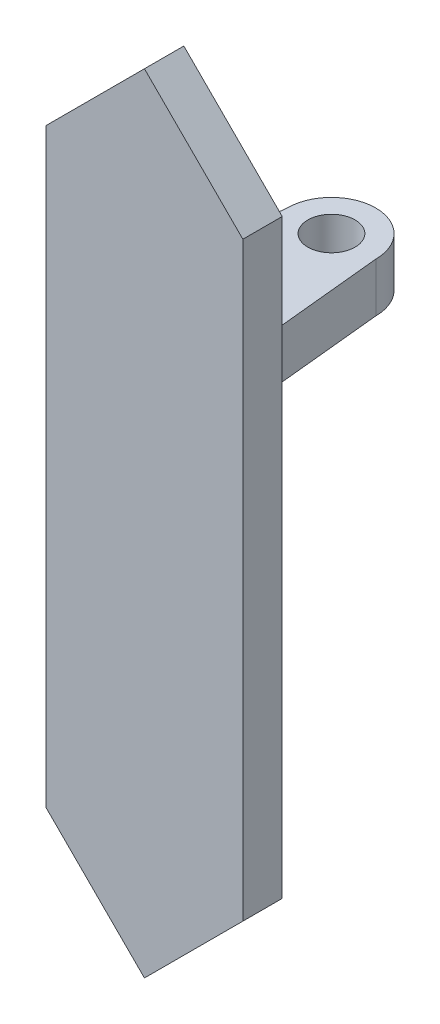
ISO-10303-21;
HEADER;
FILE_DESCRIPTION(('STEP AP214'),'2;1');
FILE_NAME('part.step','',(''),(''),'','','');
FILE_SCHEMA(('AUTOMOTIVE_DESIGN { 1 0 10303 214 1 1 1 1 }'));
ENDSEC;
DATA;
#1=APPLICATION_CONTEXT('core data for automotive mechanical design processes');
#2=APPLICATION_PROTOCOL_DEFINITION('international standard','automotive_design',2000,#1);
#3=PRODUCT_CONTEXT('',#1,'mechanical');
#4=PRODUCT('Part','Part','',(#3));
#5=PRODUCT_RELATED_PRODUCT_CATEGORY('part','',(#4));
#6=PRODUCT_DEFINITION_FORMATION('','',#4);
#7=PRODUCT_DEFINITION_CONTEXT('part definition',#1,'design');
#8=PRODUCT_DEFINITION('design','',#6,#7);
#9=PRODUCT_DEFINITION_SHAPE('','',#8);
#10=(LENGTH_UNIT() NAMED_UNIT(*) SI_UNIT(.MILLI.,.METRE.));
#11=(NAMED_UNIT(*) PLANE_ANGLE_UNIT() SI_UNIT($,.RADIAN.));
#12=(NAMED_UNIT(*) SI_UNIT($,.STERADIAN.) SOLID_ANGLE_UNIT());
#13=UNCERTAINTY_MEASURE_WITH_UNIT(LENGTH_MEASURE(1.E-05),#10,'distance_accuracy_value','');
#14=(GEOMETRIC_REPRESENTATION_CONTEXT(3) GLOBAL_UNCERTAINTY_ASSIGNED_CONTEXT((#13)) GLOBAL_UNIT_ASSIGNED_CONTEXT((#10,
#11,#12)) REPRESENTATION_CONTEXT('',''));
#15=CARTESIAN_POINT('',(0.,0.,0.));
#16=DIRECTION('',(0.,0.,1.));
#17=DIRECTION('',(1.,0.,0.));
#18=AXIS2_PLACEMENT_3D('',#15,#16,#17);
#19=CARTESIAN_POINT('',(0.,56.,-20.));
#20=DIRECTION('',(0.,1.,0.));
#21=DIRECTION('',(0.,0.,1.));
#22=AXIS2_PLACEMENT_3D('',#19,#20,#21);
#23=PLANE('',#22);
#24=CARTESIAN_POINT('',(10.1472812853162,56.,-15.));
#25=DIRECTION('',(0.,1.,0.));
#26=DIRECTION('',(0.,0.,1.));
#27=AXIS2_PLACEMENT_3D('',#24,#25,#26);
#28=CIRCLE('',#27,2.4);
#29=CARTESIAN_POINT('',(10.1472812853162,56.,-12.6));
#30=VERTEX_POINT('',#29);
#31=EDGE_CURVE('E268',#30,#30,#28,.T.);
#32=ORIENTED_EDGE('',*,*,#31,.F.);
#33=EDGE_LOOP('',(#32));
#34=FACE_BOUND('',#33,.T.);
#35=DIRECTION('',(-1.,0.,0.));
#36=VECTOR('',#35,1.);
#37=CARTESIAN_POINT('',(0.,56.,0.));
#38=LINE('',#37,#36);
#39=CARTESIAN_POINT('',(16.1472812853161,56.,0.));
#40=VERTEX_POINT('',#39);
#41=CARTESIAN_POINT('',(4.14728128531616,56.,0.));
#42=VERTEX_POINT('',#41);
#43=EDGE_CURVE('E248',#40,#42,#38,.T.);
#44=ORIENTED_EDGE('',*,*,#43,.F.);
#45=DIRECTION('',(-0.0995037190209997,0.,-0.995037190209989));
#46=VECTOR('',#45,1.);
#47=CARTESIAN_POINT('',(14.0072091933823,56.,-21.4007209193382));
#48=LINE('',#47,#46);
#49=CARTESIAN_POINT('',(14.6472812853162,56.,-15.));
#50=VERTEX_POINT('',#49);
#51=EDGE_CURVE('E260',#40,#50,#48,.T.);
#52=ORIENTED_EDGE('',*,*,#51,.T.);
#53=CARTESIAN_POINT('',(10.1472812853162,56.,-15.));
#54=DIRECTION('',(0.,1.,0.));
#55=DIRECTION('',(0.,0.,1.));
#56=AXIS2_PLACEMENT_3D('',#53,#54,#55);
#57=CIRCLE('',#56,4.5);
#58=CARTESIAN_POINT('',(5.64728128531617,56.,-15.));
#59=VERTEX_POINT('',#58);
#60=EDGE_CURVE('E256',#50,#59,#57,.T.);
#61=ORIENTED_EDGE('',*,*,#60,.T.);
#62=DIRECTION('',(0.0995037190209997,0.,-0.995037190209989));
#63=VECTOR('',#62,1.);
#64=CARTESIAN_POINT('',(6.08641711417443,56.,-19.3913582885826));
#65=LINE('',#64,#63);
#66=EDGE_CURVE('E264',#42,#59,#65,.T.);
#67=ORIENTED_EDGE('',*,*,#66,.F.);
#68=EDGE_LOOP('',(#44,#52,#61,#67));
#69=FACE_BOUND('',#68,.T.);
#70=ADVANCED_FACE('F98',(#34,#69),#23,.T.);
#71=CARTESIAN_POINT('',(0.,51.,-20.));
#72=DIRECTION('',(0.,1.,0.));
#73=DIRECTION('',(0.,0.,1.));
#74=AXIS2_PLACEMENT_3D('',#71,#72,#73);
#75=PLANE('',#74);
#76=CARTESIAN_POINT('',(10.1472812853162,51.,-15.));
#77=DIRECTION('',(0.,-1.,0.));
#78=DIRECTION('',(0.,0.,-1.));
#79=AXIS2_PLACEMENT_3D('',#76,#77,#78);
#80=CIRCLE('',#79,2.4);
#81=CARTESIAN_POINT('',(10.1472812853162,51.,-17.4));
#82=VERTEX_POINT('',#81);
#83=EDGE_CURVE('E272',#82,#82,#80,.T.);
#84=ORIENTED_EDGE('',*,*,#83,.F.);
#85=EDGE_LOOP('',(#84));
#86=FACE_BOUND('',#85,.T.);
#87=DIRECTION('',(0.0995037190209997,0.,0.995037190209989));
#88=VECTOR('',#87,1.);
#89=CARTESIAN_POINT('',(15.9874072131843,51.,-1.59874072131845));
#90=LINE('',#89,#88);
#91=CARTESIAN_POINT('',(14.6472812853162,51.,-15.));
#92=VERTEX_POINT('',#91);
#93=CARTESIAN_POINT('',(16.1472812853161,51.,0.));
#94=VERTEX_POINT('',#93);
#95=EDGE_CURVE('E280',#92,#94,#90,.T.);
#96=ORIENTED_EDGE('',*,*,#95,.T.);
#97=DIRECTION('',(-1.,0.,0.));
#98=VECTOR('',#97,1.);
#99=CARTESIAN_POINT('',(0.,51.,0.));
#100=LINE('',#99,#98);
#101=CARTESIAN_POINT('',(4.14728128531616,51.,0.));
#102=VERTEX_POINT('',#101);
#103=EDGE_CURVE('E202',#94,#102,#100,.T.);
#104=ORIENTED_EDGE('',*,*,#103,.T.);
#105=DIRECTION('',(-0.0995037190209997,0.,0.995037190209989));
#106=VECTOR('',#105,1.);
#107=CARTESIAN_POINT('',(4.10621909437243,51.,0.410621909437246));
#108=LINE('',#107,#106);
#109=CARTESIAN_POINT('',(5.64728128531617,51.,-15.));
#110=VERTEX_POINT('',#109);
#111=EDGE_CURVE('E286',#110,#102,#108,.T.);
#112=ORIENTED_EDGE('',*,*,#111,.F.);
#113=CARTESIAN_POINT('',(10.1472812853162,51.,-15.));
#114=DIRECTION('',(0.,-1.,0.));
#115=DIRECTION('',(0.,0.,-1.));
#116=AXIS2_PLACEMENT_3D('',#113,#114,#115);
#117=CIRCLE('',#116,4.5);
#118=EDGE_CURVE('E114',#110,#92,#117,.T.);
#119=ORIENTED_EDGE('',*,*,#118,.T.);
#120=EDGE_LOOP('',(#96,#104,#112,#119));
#121=FACE_BOUND('',#120,.T.);
#122=ADVANCED_FACE('F294',(#86,#121),#75,.F.);
#123=CARTESIAN_POINT('',(45.0736406426581,45.0736406426581,4.));
#124=DIRECTION('',(0.707106781186548,0.707106781186547,0.));
#125=DIRECTION('',(-0.707106781186547,0.707106781186548,0.));
#126=AXIS2_PLACEMENT_3D('',#123,#124,#125);
#127=PLANE('',#126);
#128=DIRECTION('',(0.707106781186547,-0.707106781186548,0.));
#129=VECTOR('',#128,1.);
#130=CARTESIAN_POINT('',(45.0736406426581,45.0736406426581,0.));
#131=LINE('',#130,#129);
#132=CARTESIAN_POINT('',(10.1472812853162,80.,0.));
#133=VERTEX_POINT('',#132);
#134=CARTESIAN_POINT('',(20.1472812853162,70.,0.));
#135=VERTEX_POINT('',#134);
#136=EDGE_CURVE('E210',#133,#135,#131,.T.);
#137=ORIENTED_EDGE('',*,*,#136,.F.);
#138=DIRECTION('',(0.,0.,-1.));
#139=VECTOR('',#138,1.);
#140=CARTESIAN_POINT('',(10.1472812853162,80.,4.));
#141=LINE('',#140,#139);
#142=CARTESIAN_POINT('',(10.1472812853162,80.,4.));
#143=VERTEX_POINT('',#142);
#144=EDGE_CURVE('E188',#143,#133,#141,.T.);
#145=ORIENTED_EDGE('',*,*,#144,.F.);
#146=DIRECTION('',(0.707106781186547,-0.707106781186548,0.));
#147=VECTOR('',#146,1.);
#148=CARTESIAN_POINT('',(45.0736406426581,45.0736406426581,4.));
#149=LINE('',#148,#147);
#150=CARTESIAN_POINT('',(20.1472812853162,70.,4.));
#151=VERTEX_POINT('',#150);
#152=EDGE_CURVE('E170',#143,#151,#149,.T.);
#153=ORIENTED_EDGE('',*,*,#152,.T.);
#154=DIRECTION('',(0.,0.,-1.));
#155=VECTOR('',#154,1.);
#156=CARTESIAN_POINT('',(20.1472812853162,70.,4.));
#157=LINE('',#156,#155);
#158=EDGE_CURVE('E179',#151,#135,#157,.T.);
#159=ORIENTED_EDGE('',*,*,#158,.T.);
#160=EDGE_LOOP('',(#137,#145,#153,#159));
#161=FACE_BOUND('',#160,.T.);
#162=ADVANCED_FACE('F190',(#161),#127,.T.);
#163=CARTESIAN_POINT('',(0.,0.,0.));
#164=DIRECTION('',(0.,0.,1.));
#165=DIRECTION('',(1.,0.,0.));
#166=AXIS2_PLACEMENT_3D('',#163,#164,#165);
#167=PLANE('',#166);
#168=ORIENTED_EDGE('',*,*,#43,.T.);
#169=DIRECTION('',(0.,-1.,0.));
#170=VECTOR('',#169,1.);
#171=CARTESIAN_POINT('',(4.14728128531616,0.,0.));
#172=LINE('',#171,#170);
#173=EDGE_CURVE('E252',#42,#102,#172,.T.);
#174=ORIENTED_EDGE('',*,*,#173,.T.);
#175=ORIENTED_EDGE('',*,*,#103,.F.);
#176=DIRECTION('',(0.,-1.,0.));
#177=VECTOR('',#176,1.);
#178=CARTESIAN_POINT('',(16.1472812853161,0.,0.));
#179=LINE('',#178,#177);
#180=EDGE_CURVE('E244',#40,#94,#179,.T.);
#181=ORIENTED_EDGE('',*,*,#180,.F.);
#182=EDGE_LOOP('',(#168,#174,#175,#181));
#183=FACE_BOUND('',#182,.T.);
#184=DIRECTION('',(0.,1.,0.));
#185=VECTOR('',#184,1.);
#186=CARTESIAN_POINT('',(0.147281285316174,0.,0.));
#187=LINE('',#186,#185);
#188=CARTESIAN_POINT('',(0.147281285316174,9.99999999999999,0.));
#189=VERTEX_POINT('',#188);
#190=CARTESIAN_POINT('',(0.147281285316174,70.,0.));
#191=VERTEX_POINT('',#190);
#192=EDGE_CURVE('E198',#189,#191,#187,.T.);
#193=ORIENTED_EDGE('',*,*,#192,.T.);
#194=DIRECTION('',(0.707106781186548,0.707106781186548,0.));
#195=VECTOR('',#194,1.);
#196=CARTESIAN_POINT('',(-34.9263593573419,34.9263593573419,0.));
#197=LINE('',#196,#195);
#198=EDGE_CURVE('E213',#191,#133,#197,.T.);
#199=ORIENTED_EDGE('',*,*,#198,.T.);
#200=ORIENTED_EDGE('',*,*,#136,.T.);
#201=DIRECTION('',(0.,1.,0.));
#202=VECTOR('',#201,1.);
#203=CARTESIAN_POINT('',(20.1472812853162,0.,0.));
#204=LINE('',#203,#202);
#205=CARTESIAN_POINT('',(20.1472812853162,10.,0.));
#206=VERTEX_POINT('',#205);
#207=EDGE_CURVE('E182',#206,#135,#204,.T.);
#208=ORIENTED_EDGE('',*,*,#207,.F.);
#209=DIRECTION('',(0.707106781186548,0.707106781186548,0.));
#210=VECTOR('',#209,1.);
#211=CARTESIAN_POINT('',(5.07364064265808,-5.07364064265808,0.));
#212=LINE('',#211,#210);
#213=CARTESIAN_POINT('',(10.1472812853162,0.,0.));
#214=VERTEX_POINT('',#213);
#215=EDGE_CURVE('E205',#214,#206,#212,.T.);
#216=ORIENTED_EDGE('',*,*,#215,.F.);
#217=DIRECTION('',(0.707106781186548,-0.707106781186548,0.));
#218=VECTOR('',#217,1.);
#219=CARTESIAN_POINT('',(5.07364064265808,5.07364064265808,0.));
#220=LINE('',#219,#218);
#221=EDGE_CURVE('E201',#189,#214,#220,.T.);
#222=ORIENTED_EDGE('',*,*,#221,.F.);
#223=EDGE_LOOP('',(#193,#199,#200,#208,#216,#222));
#224=FACE_BOUND('',#223,.T.);
#225=ADVANCED_FACE('F232',(#183,#224),#167,.F.);
#226=CARTESIAN_POINT('',(20.1472812853162,0.,4.));
#227=DIRECTION('',(-1.,0.,0.));
#228=DIRECTION('',(0.,0.,1.));
#229=AXIS2_PLACEMENT_3D('',#226,#227,#228);
#230=PLANE('',#229);
#231=ORIENTED_EDGE('',*,*,#207,.T.);
#232=ORIENTED_EDGE('',*,*,#158,.F.);
#233=DIRECTION('',(0.,1.,0.));
#234=VECTOR('',#233,1.);
#235=CARTESIAN_POINT('',(20.1472812853162,0.,4.));
#236=LINE('',#235,#234);
#237=CARTESIAN_POINT('',(20.1472812853162,10.,4.));
#238=VERTEX_POINT('',#237);
#239=EDGE_CURVE('E164',#238,#151,#236,.T.);
#240=ORIENTED_EDGE('',*,*,#239,.F.);
#241=DIRECTION('',(0.,0.,-1.));
#242=VECTOR('',#241,1.);
#243=CARTESIAN_POINT('',(20.1472812853162,10.,4.));
#244=LINE('',#243,#242);
#245=EDGE_CURVE('E187',#238,#206,#244,.T.);
#246=ORIENTED_EDGE('',*,*,#245,.T.);
#247=EDGE_LOOP('',(#231,#232,#240,#246));
#248=FACE_BOUND('',#247,.T.);
#249=ADVANCED_FACE('F180',(#248),#230,.F.);
#250=CARTESIAN_POINT('',(5.07364064265808,-5.07364064265808,4.));
#251=DIRECTION('',(-0.707106781186547,0.707106781186547,0.));
#252=DIRECTION('',(-0.707106781186548,-0.707106781186548,0.));
#253=AXIS2_PLACEMENT_3D('',#250,#251,#252);
#254=PLANE('',#253);
#255=ORIENTED_EDGE('',*,*,#215,.T.);
#256=ORIENTED_EDGE('',*,*,#245,.F.);
#257=DIRECTION('',(0.707106781186548,0.707106781186548,0.));
#258=VECTOR('',#257,1.);
#259=CARTESIAN_POINT('',(5.07364064265808,-5.07364064265808,4.));
#260=LINE('',#259,#258);
#261=CARTESIAN_POINT('',(10.1472812853162,0.,4.));
#262=VERTEX_POINT('',#261);
#263=EDGE_CURVE('E172',#262,#238,#260,.T.);
#264=ORIENTED_EDGE('',*,*,#263,.F.);
#265=DIRECTION('',(0.,0.,-1.));
#266=VECTOR('',#265,1.);
#267=CARTESIAN_POINT('',(10.1472812853162,0.,4.));
#268=LINE('',#267,#266);
#269=EDGE_CURVE('E107',#262,#214,#268,.T.);
#270=ORIENTED_EDGE('',*,*,#269,.T.);
#271=EDGE_LOOP('',(#255,#256,#264,#270));
#272=FACE_BOUND('',#271,.T.);
#273=ADVANCED_FACE('F228',(#272),#254,.F.);
#274=CARTESIAN_POINT('',(5.07364064265808,5.07364064265808,4.));
#275=DIRECTION('',(0.707106781186547,0.707106781186547,0.));
#276=DIRECTION('',(-0.707106781186548,0.707106781186548,0.));
#277=AXIS2_PLACEMENT_3D('',#274,#275,#276);
#278=PLANE('',#277);
#279=ORIENTED_EDGE('',*,*,#221,.T.);
#280=ORIENTED_EDGE('',*,*,#269,.F.);
#281=DIRECTION('',(0.707106781186548,-0.707106781186548,0.));
#282=VECTOR('',#281,1.);
#283=CARTESIAN_POINT('',(5.07364064265808,5.07364064265808,4.));
#284=LINE('',#283,#282);
#285=CARTESIAN_POINT('',(0.147281285316174,9.99999999999999,4.));
#286=VERTEX_POINT('',#285);
#287=EDGE_CURVE('E234',#286,#262,#284,.T.);
#288=ORIENTED_EDGE('',*,*,#287,.F.);
#289=DIRECTION('',(0.,0.,-1.));
#290=VECTOR('',#289,1.);
#291=CARTESIAN_POINT('',(0.147281285316174,9.99999999999999,4.));
#292=LINE('',#291,#290);
#293=EDGE_CURVE('E12',#286,#189,#292,.T.);
#294=ORIENTED_EDGE('',*,*,#293,.T.);
#295=EDGE_LOOP('',(#279,#280,#288,#294));
#296=FACE_BOUND('',#295,.T.);
#297=ADVANCED_FACE('F351',(#296),#278,.F.);
#298=CARTESIAN_POINT('',(0.147281285316174,0.,4.));
#299=DIRECTION('',(-1.,0.,0.));
#300=DIRECTION('',(0.,0.,1.));
#301=AXIS2_PLACEMENT_3D('',#298,#299,#300);
#302=PLANE('',#301);
#303=ORIENTED_EDGE('',*,*,#192,.F.);
#304=ORIENTED_EDGE('',*,*,#293,.F.);
#305=DIRECTION('',(0.,1.,0.));
#306=VECTOR('',#305,1.);
#307=CARTESIAN_POINT('',(0.147281285316174,0.,4.));
#308=LINE('',#307,#306);
#309=CARTESIAN_POINT('',(0.147281285316174,70.,4.));
#310=VERTEX_POINT('',#309);
#311=EDGE_CURVE('E217',#286,#310,#308,.T.);
#312=ORIENTED_EDGE('',*,*,#311,.T.);
#313=DIRECTION('',(0.,0.,-1.));
#314=VECTOR('',#313,1.);
#315=CARTESIAN_POINT('',(0.147281285316174,70.,4.));
#316=LINE('',#315,#314);
#317=EDGE_CURVE('E123',#310,#191,#316,.T.);
#318=ORIENTED_EDGE('',*,*,#317,.T.);
#319=EDGE_LOOP('',(#303,#304,#312,#318));
#320=FACE_BOUND('',#319,.T.);
#321=ADVANCED_FACE('F100',(#320),#302,.T.);
#322=CARTESIAN_POINT('',(-34.9263593573419,34.9263593573419,4.));
#323=DIRECTION('',(-0.707106781186547,0.707106781186547,0.));
#324=DIRECTION('',(-0.707106781186548,-0.707106781186548,0.));
#325=AXIS2_PLACEMENT_3D('',#322,#323,#324);
#326=PLANE('',#325);
#327=ORIENTED_EDGE('',*,*,#198,.F.);
#328=ORIENTED_EDGE('',*,*,#317,.F.);
#329=DIRECTION('',(0.707106781186548,0.707106781186548,0.));
#330=VECTOR('',#329,1.);
#331=CARTESIAN_POINT('',(-34.9263593573419,34.9263593573419,4.));
#332=LINE('',#331,#330);
#333=EDGE_CURVE('E192',#310,#143,#332,.T.);
#334=ORIENTED_EDGE('',*,*,#333,.T.);
#335=ORIENTED_EDGE('',*,*,#144,.T.);
#336=EDGE_LOOP('',(#327,#328,#334,#335));
#337=FACE_BOUND('',#336,.T.);
#338=ADVANCED_FACE('F233',(#337),#326,.T.);
#339=CARTESIAN_POINT('',(0.,0.,4.));
#340=DIRECTION('',(0.,0.,1.));
#341=DIRECTION('',(1.,0.,0.));
#342=AXIS2_PLACEMENT_3D('',#339,#340,#341);
#343=PLANE('',#342);
#344=ORIENTED_EDGE('',*,*,#311,.F.);
#345=ORIENTED_EDGE('',*,*,#287,.T.);
#346=ORIENTED_EDGE('',*,*,#263,.T.);
#347=ORIENTED_EDGE('',*,*,#239,.T.);
#348=ORIENTED_EDGE('',*,*,#152,.F.);
#349=ORIENTED_EDGE('',*,*,#333,.F.);
#350=EDGE_LOOP('',(#344,#345,#346,#347,#348,#349));
#351=FACE_BOUND('',#350,.T.);
#352=ADVANCED_FACE('F167',(#351),#343,.T.);
#353=CARTESIAN_POINT('',(10.1472812853162,72.,-15.));
#354=DIRECTION('',(0.,-1.,0.));
#355=DIRECTION('',(0.,0.,-1.));
#356=AXIS2_PLACEMENT_3D('',#353,#354,#355);
#357=CYLINDRICAL_SURFACE('',#356,2.4);
#358=ORIENTED_EDGE('',*,*,#31,.T.);
#359=EDGE_LOOP('',(#358));
#360=FACE_BOUND('',#359,.T.);
#361=ORIENTED_EDGE('',*,*,#83,.T.);
#362=EDGE_LOOP('',(#361));
#363=FACE_BOUND('',#362,.T.);
#364=ADVANCED_FACE('F341',(#360,#363),#357,.F.);
#365=CARTESIAN_POINT('',(10.1472812853162,72.,-15.));
#366=DIRECTION('',(0.,-1.,0.));
#367=DIRECTION('',(0.,0.,-1.));
#368=AXIS2_PLACEMENT_3D('',#365,#366,#367);
#369=CYLINDRICAL_SURFACE('',#368,4.5);
#370=DIRECTION('',(0.,-1.,0.));
#371=VECTOR('',#370,1.);
#372=CARTESIAN_POINT('',(14.6472812853162,72.,-15.));
#373=LINE('',#372,#371);
#374=EDGE_CURVE('E276',#50,#92,#373,.T.);
#375=ORIENTED_EDGE('',*,*,#374,.T.);
#376=ORIENTED_EDGE('',*,*,#118,.F.);
#377=DIRECTION('',(0.,-1.,0.));
#378=VECTOR('',#377,1.);
#379=CARTESIAN_POINT('',(5.64728128531617,72.,-15.));
#380=LINE('',#379,#378);
#381=EDGE_CURVE('E277',#59,#110,#380,.T.);
#382=ORIENTED_EDGE('',*,*,#381,.F.);
#383=ORIENTED_EDGE('',*,*,#60,.F.);
#384=EDGE_LOOP('',(#375,#376,#382,#383));
#385=FACE_BOUND('',#384,.T.);
#386=ADVANCED_FACE('F313',(#385),#369,.T.);
#387=CARTESIAN_POINT('',(15.9874072131843,72.,-1.59874072131845));
#388=DIRECTION('',(0.995037190209989,0.,-0.0995037190209997));
#389=DIRECTION('',(-0.0995037190209997,0.,-0.995037190209989));
#390=AXIS2_PLACEMENT_3D('',#387,#388,#389);
#391=PLANE('',#390);
#392=ORIENTED_EDGE('',*,*,#180,.T.);
#393=ORIENTED_EDGE('',*,*,#95,.F.);
#394=ORIENTED_EDGE('',*,*,#374,.F.);
#395=ORIENTED_EDGE('',*,*,#51,.F.);
#396=EDGE_LOOP('',(#392,#393,#394,#395));
#397=FACE_BOUND('',#396,.T.);
#398=ADVANCED_FACE('F316',(#397),#391,.T.);
#399=CARTESIAN_POINT('',(4.10621909437243,72.,0.410621909437246));
#400=DIRECTION('',(0.995037190209989,0.,0.0995037190209996));
#401=DIRECTION('',(0.0995037190209997,0.,-0.995037190209989));
#402=AXIS2_PLACEMENT_3D('',#399,#400,#401);
#403=PLANE('',#402);
#404=ORIENTED_EDGE('',*,*,#66,.T.);
#405=ORIENTED_EDGE('',*,*,#381,.T.);
#406=ORIENTED_EDGE('',*,*,#111,.T.);
#407=ORIENTED_EDGE('',*,*,#173,.F.);
#408=EDGE_LOOP('',(#404,#405,#406,#407));
#409=FACE_BOUND('',#408,.T.);
#410=ADVANCED_FACE('F320',(#409),#403,.F.);
#411=CLOSED_SHELL('',(#70,#122,#162,#225,#249,#273,#297,#321,#338,#352,#364,#386,#398,#410));
#412=MANIFOLD_SOLID_BREP('B2',#411);
#413=ADVANCED_BREP_SHAPE_REPRESENTATION('',(#18,#412),#14);
#414=SHAPE_DEFINITION_REPRESENTATION(#9,#413);
ENDSEC;
END-ISO-10303-21;
